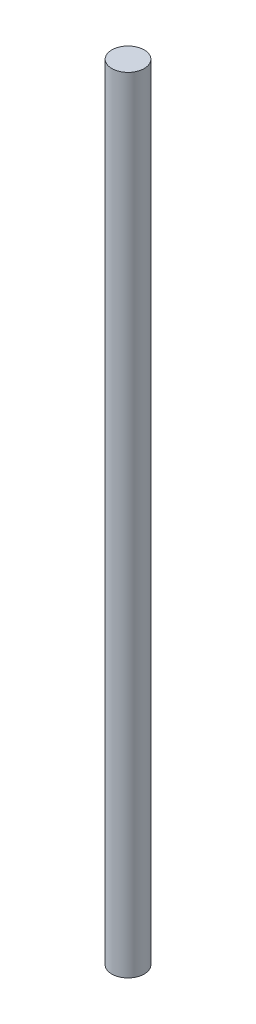
ISO-10303-21;
HEADER;
FILE_DESCRIPTION(('STEP AP214'),'2;1');
FILE_NAME('part.step','',(''),(''),'','','');
FILE_SCHEMA(('AUTOMOTIVE_DESIGN { 1 0 10303 214 1 1 1 1 }'));
ENDSEC;
DATA;
#1=APPLICATION_CONTEXT('core data for automotive mechanical design processes');
#2=APPLICATION_PROTOCOL_DEFINITION('international standard','automotive_design',2000,#1);
#3=PRODUCT_CONTEXT('',#1,'mechanical');
#4=PRODUCT('Part','Part','',(#3));
#5=PRODUCT_RELATED_PRODUCT_CATEGORY('part','',(#4));
#6=PRODUCT_DEFINITION_FORMATION('','',#4);
#7=PRODUCT_DEFINITION_CONTEXT('part definition',#1,'design');
#8=PRODUCT_DEFINITION('design','',#6,#7);
#9=PRODUCT_DEFINITION_SHAPE('','',#8);
#10=(LENGTH_UNIT() NAMED_UNIT(*) SI_UNIT(.MILLI.,.METRE.));
#11=(NAMED_UNIT(*) PLANE_ANGLE_UNIT() SI_UNIT($,.RADIAN.));
#12=(NAMED_UNIT(*) SI_UNIT($,.STERADIAN.) SOLID_ANGLE_UNIT());
#13=UNCERTAINTY_MEASURE_WITH_UNIT(LENGTH_MEASURE(1.E-05),#10,'distance_accuracy_value','');
#14=(GEOMETRIC_REPRESENTATION_CONTEXT(3) GLOBAL_UNCERTAINTY_ASSIGNED_CONTEXT((#13)) GLOBAL_UNIT_ASSIGNED_CONTEXT((#10,
#11,#12)) REPRESENTATION_CONTEXT('',''));
#15=CARTESIAN_POINT('',(0.,0.,0.));
#16=DIRECTION('',(0.,0.,1.));
#17=DIRECTION('',(1.,0.,0.));
#18=AXIS2_PLACEMENT_3D('',#15,#16,#17);
#19=CARTESIAN_POINT('',(0.,97.,0.));
#20=DIRECTION('',(0.,-1.,0.));
#21=DIRECTION('',(0.,0.,-1.));
#22=AXIS2_PLACEMENT_3D('',#19,#20,#21);
#23=CYLINDRICAL_SURFACE('',#22,2.);
#24=CARTESIAN_POINT('',(0.,97.,0.));
#25=DIRECTION('',(0.,1.,0.));
#26=DIRECTION('',(0.,0.,1.));
#27=AXIS2_PLACEMENT_3D('',#24,#25,#26);
#28=CIRCLE('',#27,2.);
#29=CARTESIAN_POINT('',(0.,97.,-2.));
#30=VERTEX_POINT('',#29);
#31=EDGE_CURVE('E10',#30,#30,#28,.T.);
#32=CARTESIAN_POINT('',(0.,0.,0.));
#33=DIRECTION('',(0.,1.,0.));
#34=DIRECTION('',(0.,0.,1.));
#35=AXIS2_PLACEMENT_3D('',#32,#33,#34);
#36=CIRCLE('',#35,2.);
#37=CARTESIAN_POINT('',(0.,0.,-2.));
#38=VERTEX_POINT('',#37);
#39=EDGE_CURVE('E35',#38,#38,#36,.T.);
#40=CARTESIAN_POINT('',(0.,97.,-2.));
#41=CARTESIAN_POINT('',(0.,95.9895833333333,-2.));
#42=CARTESIAN_POINT('',(0.,94.9791666666667,-2.));
#43=CARTESIAN_POINT('',(0.,92.9583333333333,-2.));
#44=CARTESIAN_POINT('',(0.,91.9479166666667,-2.));
#45=CARTESIAN_POINT('',(0.,89.9270833333333,-2.));
#46=CARTESIAN_POINT('',(0.,88.9166666666667,-2.));
#47=CARTESIAN_POINT('',(0.,86.8958333333333,-2.));
#48=CARTESIAN_POINT('',(0.,85.8854166666667,-2.));
#49=CARTESIAN_POINT('',(0.,83.8645833333333,-2.));
#50=CARTESIAN_POINT('',(0.,82.8541666666667,-2.));
#51=CARTESIAN_POINT('',(0.,80.8333333333333,-2.));
#52=CARTESIAN_POINT('',(0.,79.8229166666667,-2.));
#53=CARTESIAN_POINT('',(0.,77.8020833333333,-2.));
#54=CARTESIAN_POINT('',(0.,76.7916666666667,-2.));
#55=CARTESIAN_POINT('',(0.,74.7708333333333,-2.));
#56=CARTESIAN_POINT('',(0.,73.7604166666667,-2.));
#57=CARTESIAN_POINT('',(0.,71.7395833333333,-2.));
#58=CARTESIAN_POINT('',(0.,70.7291666666667,-2.));
#59=CARTESIAN_POINT('',(0.,68.7083333333333,-2.));
#60=CARTESIAN_POINT('',(0.,67.6979166666667,-2.));
#61=CARTESIAN_POINT('',(0.,65.6770833333333,-2.));
#62=CARTESIAN_POINT('',(0.,64.6666666666667,-2.));
#63=CARTESIAN_POINT('',(0.,62.6458333333333,-2.));
#64=CARTESIAN_POINT('',(0.,61.6354166666667,-2.));
#65=CARTESIAN_POINT('',(0.,59.6145833333333,-2.));
#66=CARTESIAN_POINT('',(0.,58.6041666666667,-2.));
#67=CARTESIAN_POINT('',(0.,56.5833333333333,-2.));
#68=CARTESIAN_POINT('',(0.,55.5729166666667,-2.));
#69=CARTESIAN_POINT('',(0.,53.5520833333333,-2.));
#70=CARTESIAN_POINT('',(0.,52.5416666666667,-2.));
#71=CARTESIAN_POINT('',(0.,50.5208333333333,-2.));
#72=CARTESIAN_POINT('',(0.,49.5104166666667,-2.));
#73=CARTESIAN_POINT('',(0.,47.4895833333333,-2.));
#74=CARTESIAN_POINT('',(0.,46.4791666666667,-2.));
#75=CARTESIAN_POINT('',(0.,44.4583333333333,-2.));
#76=CARTESIAN_POINT('',(0.,43.4479166666667,-2.));
#77=CARTESIAN_POINT('',(0.,41.4270833333333,-2.));
#78=CARTESIAN_POINT('',(0.,40.4166666666667,-2.));
#79=CARTESIAN_POINT('',(0.,38.3958333333333,-2.));
#80=CARTESIAN_POINT('',(0.,37.3854166666667,-2.));
#81=CARTESIAN_POINT('',(0.,35.3645833333333,-2.));
#82=CARTESIAN_POINT('',(0.,34.3541666666667,-2.));
#83=CARTESIAN_POINT('',(0.,32.3333333333333,-2.));
#84=CARTESIAN_POINT('',(0.,31.3229166666667,-2.));
#85=CARTESIAN_POINT('',(0.,29.3020833333333,-2.));
#86=CARTESIAN_POINT('',(0.,28.2916666666667,-2.));
#87=CARTESIAN_POINT('',(0.,26.2708333333333,-2.));
#88=CARTESIAN_POINT('',(0.,25.2604166666667,-2.));
#89=CARTESIAN_POINT('',(0.,23.2395833333333,-2.));
#90=CARTESIAN_POINT('',(0.,22.2291666666667,-2.));
#91=CARTESIAN_POINT('',(0.,20.2083333333333,-2.));
#92=CARTESIAN_POINT('',(0.,19.1979166666667,-2.));
#93=CARTESIAN_POINT('',(0.,17.1770833333333,-2.));
#94=CARTESIAN_POINT('',(0.,16.1666666666667,-2.));
#95=CARTESIAN_POINT('',(0.,14.1458333333333,-2.));
#96=CARTESIAN_POINT('',(0.,13.1354166666667,-2.));
#97=CARTESIAN_POINT('',(0.,11.1145833333333,-2.));
#98=CARTESIAN_POINT('',(0.,10.1041666666667,-2.));
#99=CARTESIAN_POINT('',(0.,8.08333333333332,-2.));
#100=CARTESIAN_POINT('',(0.,7.07291666666665,-2.));
#101=CARTESIAN_POINT('',(0.,5.05208333333332,-2.));
#102=CARTESIAN_POINT('',(0.,4.04166666666665,-2.));
#103=CARTESIAN_POINT('',(0.,2.02083333333332,-2.));
#104=CARTESIAN_POINT('',(0.,1.01041666666665,-2.));
#105=CARTESIAN_POINT('',(0.,0.,-2.));
#106=B_SPLINE_CURVE_WITH_KNOTS('',3,(#40,#41,#42,#43,#44,#45,#46,#47,#48,#49,#50,#51,#52,#53,
#54,#55,#56,#57,#58,#59,#60,#61,#62,#63,#64,#65,#66,#67,#68,#69,#70,#71,#72,#73,#74,#75,#76,#77,
#78,#79,#80,#81,#82,#83,#84,#85,#86,#87,#88,#89,#90,#91,#92,#93,#94,#95,#96,#97,#98,#99,#100,
#101,#102,#103,#104,#105),.UNSPECIFIED.,.F.,.F.,(4,2,2,2,2,2,2,2,2,2,2,2,2,2,2,2,2,2,2,2,2,2,2,
2,2,2,2,2,2,2,2,2,4),(0.,3.03125,6.0625,9.09375,12.125,15.15625,18.1875,21.21875,24.25,27.28125,
30.3125,33.34375,36.375,39.40625,42.4375,45.46875,48.5,51.53125,54.5625,57.59375,60.625,
63.65625,66.6875,69.71875,72.75,75.78125,78.8125,81.84375,84.875,87.90625,90.9375,93.96875,97.),.UNSPECIFIED.);
#107=EDGE_CURVE('BSEAM32',#30,#38,#106,.T.);
#108=ORIENTED_EDGE('',*,*,#31,.F.);
#109=ORIENTED_EDGE('',*,*,#39,.T.);
#110=ORIENTED_EDGE('',*,*,#107,.T.);
#111=ORIENTED_EDGE('',*,*,#107,.F.);
#112=EDGE_LOOP('',(#108,#110,#109,#111));
#113=FACE_BOUND('',#112,.T.);
#114=ADVANCED_FACE('F32',(#113),#23,.T.);
#115=CARTESIAN_POINT('',(0.,97.,0.));
#116=DIRECTION('',(0.,1.,0.));
#117=DIRECTION('',(0.,0.,1.));
#118=AXIS2_PLACEMENT_3D('',#115,#116,#117);
#119=PLANE('',#118);
#120=ORIENTED_EDGE('',*,*,#31,.T.);
#121=EDGE_LOOP('',(#120));
#122=FACE_BOUND('',#121,.T.);
#123=ADVANCED_FACE('F47',(#122),#119,.T.);
#124=CARTESIAN_POINT('',(0.,0.,0.));
#125=DIRECTION('',(0.,1.,0.));
#126=DIRECTION('',(0.,0.,1.));
#127=AXIS2_PLACEMENT_3D('',#124,#125,#126);
#128=PLANE('',#127);
#129=ORIENTED_EDGE('',*,*,#39,.F.);
#130=EDGE_LOOP('',(#129));
#131=FACE_BOUND('',#130,.T.);
#132=ADVANCED_FACE('F45',(#131),#128,.F.);
#133=CLOSED_SHELL('',(#114,#123,#132));
#134=MANIFOLD_SOLID_BREP('B2',#133);
#135=ADVANCED_BREP_SHAPE_REPRESENTATION('',(#18,#134),#14);
#136=SHAPE_DEFINITION_REPRESENTATION(#9,#135);
ENDSEC;
END-ISO-10303-21;
